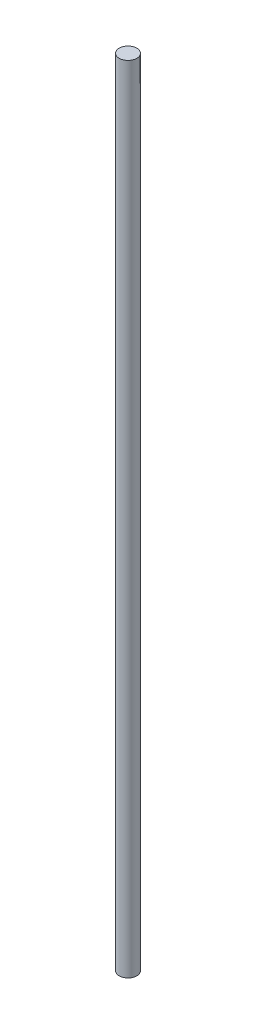
ISO-10303-21;
HEADER;
FILE_DESCRIPTION(('STEP AP214'),'2;1');
FILE_NAME('part.step','',(''),(''),'','','');
FILE_SCHEMA(('AUTOMOTIVE_DESIGN { 1 0 10303 214 1 1 1 1 }'));
ENDSEC;
DATA;
#1=APPLICATION_CONTEXT('core data for automotive mechanical design processes');
#2=APPLICATION_PROTOCOL_DEFINITION('international standard','automotive_design',2000,#1);
#3=PRODUCT_CONTEXT('',#1,'mechanical');
#4=PRODUCT('Part','Part','',(#3));
#5=PRODUCT_RELATED_PRODUCT_CATEGORY('part','',(#4));
#6=PRODUCT_DEFINITION_FORMATION('','',#4);
#7=PRODUCT_DEFINITION_CONTEXT('part definition',#1,'design');
#8=PRODUCT_DEFINITION('design','',#6,#7);
#9=PRODUCT_DEFINITION_SHAPE('','',#8);
#10=(LENGTH_UNIT() NAMED_UNIT(*) SI_UNIT(.MILLI.,.METRE.));
#11=(NAMED_UNIT(*) PLANE_ANGLE_UNIT() SI_UNIT($,.RADIAN.));
#12=(NAMED_UNIT(*) SI_UNIT($,.STERADIAN.) SOLID_ANGLE_UNIT());
#13=UNCERTAINTY_MEASURE_WITH_UNIT(LENGTH_MEASURE(1.E-05),#10,'distance_accuracy_value','');
#14=(GEOMETRIC_REPRESENTATION_CONTEXT(3) GLOBAL_UNCERTAINTY_ASSIGNED_CONTEXT((#13)) GLOBAL_UNIT_ASSIGNED_CONTEXT((#10,
#11,#12)) REPRESENTATION_CONTEXT('',''));
#15=CARTESIAN_POINT('',(0.,0.,0.));
#16=DIRECTION('',(0.,0.,1.));
#17=DIRECTION('',(1.,0.,0.));
#18=AXIS2_PLACEMENT_3D('',#15,#16,#17);
#19=CARTESIAN_POINT('',(0.,360.,0.));
#20=DIRECTION('',(0.,-1.,0.));
#21=DIRECTION('',(0.,0.,-1.));
#22=AXIS2_PLACEMENT_3D('',#19,#20,#21);
#23=CYLINDRICAL_SURFACE('',#22,4.);
#24=CARTESIAN_POINT('',(0.,360.,0.));
#25=DIRECTION('',(0.,1.,0.));
#26=DIRECTION('',(0.,0.,1.));
#27=AXIS2_PLACEMENT_3D('',#24,#25,#26);
#28=CIRCLE('',#27,4.);
#29=CARTESIAN_POINT('',(0.,360.,-4.));
#30=VERTEX_POINT('',#29);
#31=EDGE_CURVE('E10',#30,#30,#28,.T.);
#32=CARTESIAN_POINT('',(0.,0.,0.));
#33=DIRECTION('',(0.,1.,0.));
#34=DIRECTION('',(0.,0.,1.));
#35=AXIS2_PLACEMENT_3D('',#32,#33,#34);
#36=CIRCLE('',#35,4.);
#37=CARTESIAN_POINT('',(0.,0.,-4.));
#38=VERTEX_POINT('',#37);
#39=EDGE_CURVE('E34',#38,#38,#36,.T.);
#40=CARTESIAN_POINT('',(0.,360.,-4.));
#41=CARTESIAN_POINT('',(0.,356.25,-4.));
#42=CARTESIAN_POINT('',(0.,352.5,-4.));
#43=CARTESIAN_POINT('',(0.,345.,-4.));
#44=CARTESIAN_POINT('',(0.,341.25,-4.));
#45=CARTESIAN_POINT('',(0.,333.75,-4.));
#46=CARTESIAN_POINT('',(0.,330.,-4.));
#47=CARTESIAN_POINT('',(0.,322.5,-4.));
#48=CARTESIAN_POINT('',(0.,318.75,-4.));
#49=CARTESIAN_POINT('',(0.,311.25,-4.));
#50=CARTESIAN_POINT('',(0.,307.5,-4.));
#51=CARTESIAN_POINT('',(0.,300.,-4.));
#52=CARTESIAN_POINT('',(0.,296.25,-4.));
#53=CARTESIAN_POINT('',(0.,288.75,-4.));
#54=CARTESIAN_POINT('',(0.,285.,-4.));
#55=CARTESIAN_POINT('',(0.,277.5,-4.));
#56=CARTESIAN_POINT('',(0.,273.75,-4.));
#57=CARTESIAN_POINT('',(0.,266.25,-4.));
#58=CARTESIAN_POINT('',(0.,262.5,-4.));
#59=CARTESIAN_POINT('',(0.,255.,-4.));
#60=CARTESIAN_POINT('',(0.,251.25,-4.));
#61=CARTESIAN_POINT('',(0.,243.75,-4.));
#62=CARTESIAN_POINT('',(0.,240.,-4.));
#63=CARTESIAN_POINT('',(0.,232.5,-4.));
#64=CARTESIAN_POINT('',(0.,228.75,-4.));
#65=CARTESIAN_POINT('',(0.,221.25,-4.));
#66=CARTESIAN_POINT('',(0.,217.5,-4.));
#67=CARTESIAN_POINT('',(0.,210.,-4.));
#68=CARTESIAN_POINT('',(0.,206.25,-4.));
#69=CARTESIAN_POINT('',(0.,198.75,-4.));
#70=CARTESIAN_POINT('',(0.,195.,-4.));
#71=CARTESIAN_POINT('',(0.,187.5,-4.));
#72=CARTESIAN_POINT('',(0.,183.75,-4.));
#73=CARTESIAN_POINT('',(0.,176.25,-4.));
#74=CARTESIAN_POINT('',(0.,172.5,-4.));
#75=CARTESIAN_POINT('',(0.,165.,-4.));
#76=CARTESIAN_POINT('',(0.,161.25,-4.));
#77=CARTESIAN_POINT('',(0.,153.75,-4.));
#78=CARTESIAN_POINT('',(0.,150.,-4.));
#79=CARTESIAN_POINT('',(0.,142.5,-4.));
#80=CARTESIAN_POINT('',(0.,138.75,-4.));
#81=CARTESIAN_POINT('',(0.,131.25,-4.));
#82=CARTESIAN_POINT('',(0.,127.5,-4.));
#83=CARTESIAN_POINT('',(0.,120.,-4.));
#84=CARTESIAN_POINT('',(0.,116.25,-4.));
#85=CARTESIAN_POINT('',(0.,108.75,-4.));
#86=CARTESIAN_POINT('',(0.,105.,-4.));
#87=CARTESIAN_POINT('',(0.,97.5,-4.));
#88=CARTESIAN_POINT('',(0.,93.75,-4.));
#89=CARTESIAN_POINT('',(0.,86.25,-4.));
#90=CARTESIAN_POINT('',(0.,82.5,-4.));
#91=CARTESIAN_POINT('',(0.,75.,-4.));
#92=CARTESIAN_POINT('',(0.,71.25,-4.));
#93=CARTESIAN_POINT('',(0.,63.75,-4.));
#94=CARTESIAN_POINT('',(0.,60.,-4.));
#95=CARTESIAN_POINT('',(0.,52.5,-4.));
#96=CARTESIAN_POINT('',(0.,48.75,-4.));
#97=CARTESIAN_POINT('',(0.,41.25,-4.));
#98=CARTESIAN_POINT('',(0.,37.5,-4.));
#99=CARTESIAN_POINT('',(0.,30.,-4.));
#100=CARTESIAN_POINT('',(0.,26.25,-4.));
#101=CARTESIAN_POINT('',(0.,18.75,-4.));
#102=CARTESIAN_POINT('',(0.,14.9999999999999,-4.));
#103=CARTESIAN_POINT('',(0.,7.49999999999993,-4.));
#104=CARTESIAN_POINT('',(0.,3.74999999999994,-4.));
#105=CARTESIAN_POINT('',(0.,0.,-4.));
#106=B_SPLINE_CURVE_WITH_KNOTS('',3,(#40,#41,#42,#43,#44,#45,#46,#47,#48,#49,#50,#51,#52,#53,
#54,#55,#56,#57,#58,#59,#60,#61,#62,#63,#64,#65,#66,#67,#68,#69,#70,#71,#72,#73,#74,#75,#76,#77,
#78,#79,#80,#81,#82,#83,#84,#85,#86,#87,#88,#89,#90,#91,#92,#93,#94,#95,#96,#97,#98,#99,#100,
#101,#102,#103,#104,#105),.UNSPECIFIED.,.F.,.F.,(4,2,2,2,2,2,2,2,2,2,2,2,2,2,2,2,2,2,2,2,2,2,2,
2,2,2,2,2,2,2,2,2,4),(0.,11.25,22.5,33.7500000000001,45.,56.25,67.5,78.75,90.,101.25,112.5,
123.75,135.,146.25,157.5,168.75,180.,191.25,202.5,213.75,225.,236.25,247.5,258.75,270.,281.25,
292.5,303.75,315.,326.25,337.5,348.75,360.),.UNSPECIFIED.);
#107=EDGE_CURVE('BSEAM31',#30,#38,#106,.T.);
#108=ORIENTED_EDGE('',*,*,#31,.F.);
#109=ORIENTED_EDGE('',*,*,#39,.T.);
#110=ORIENTED_EDGE('',*,*,#107,.T.);
#111=ORIENTED_EDGE('',*,*,#107,.F.);
#112=EDGE_LOOP('',(#108,#110,#109,#111));
#113=FACE_BOUND('',#112,.T.);
#114=ADVANCED_FACE('F31',(#113),#23,.T.);
#115=CARTESIAN_POINT('',(0.,360.,0.));
#116=DIRECTION('',(0.,1.,0.));
#117=DIRECTION('',(0.,0.,1.));
#118=AXIS2_PLACEMENT_3D('',#115,#116,#117);
#119=PLANE('',#118);
#120=ORIENTED_EDGE('',*,*,#31,.T.);
#121=EDGE_LOOP('',(#120));
#122=FACE_BOUND('',#121,.T.);
#123=ADVANCED_FACE('F46',(#122),#119,.T.);
#124=CARTESIAN_POINT('',(0.,0.,0.));
#125=DIRECTION('',(0.,1.,0.));
#126=DIRECTION('',(0.,0.,1.));
#127=AXIS2_PLACEMENT_3D('',#124,#125,#126);
#128=PLANE('',#127);
#129=ORIENTED_EDGE('',*,*,#39,.F.);
#130=EDGE_LOOP('',(#129));
#131=FACE_BOUND('',#130,.T.);
#132=ADVANCED_FACE('F44',(#131),#128,.F.);
#133=CLOSED_SHELL('',(#114,#123,#132));
#134=MANIFOLD_SOLID_BREP('B2',#133);
#135=ADVANCED_BREP_SHAPE_REPRESENTATION('',(#18,#134),#14);
#136=SHAPE_DEFINITION_REPRESENTATION(#9,#135);
ENDSEC;
END-ISO-10303-21;
